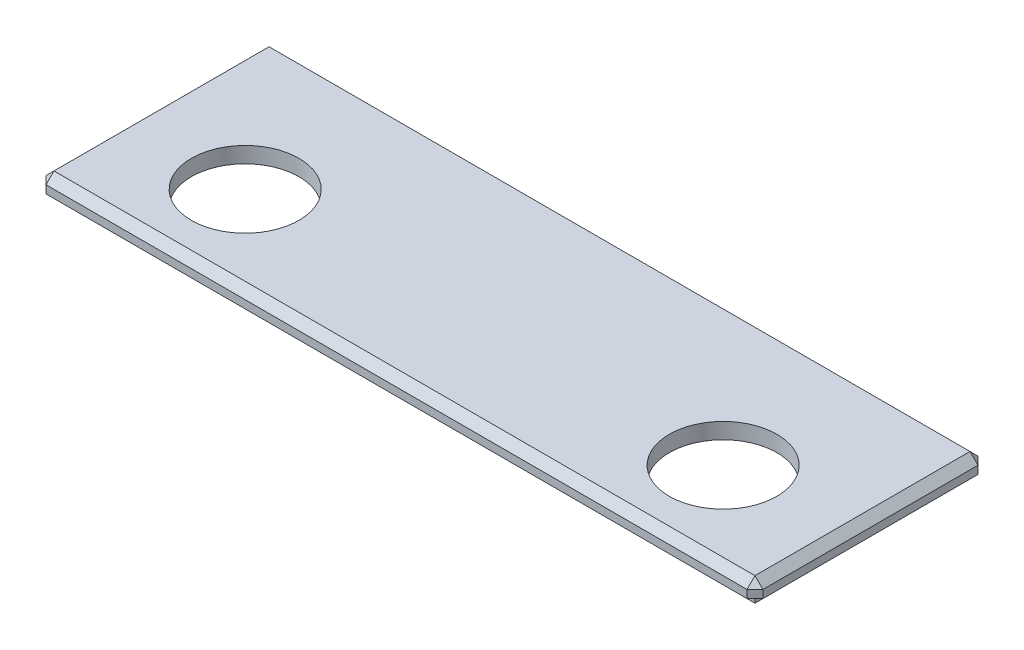
ISO-10303-21;
HEADER;
FILE_DESCRIPTION(('STEP AP214'),'2;1');
FILE_NAME('part.step','',(''),(''),'','','');
FILE_SCHEMA(('AUTOMOTIVE_DESIGN { 1 0 10303 214 1 1 1 1 }'));
ENDSEC;
DATA;
#1=APPLICATION_CONTEXT('core data for automotive mechanical design processes');
#2=APPLICATION_PROTOCOL_DEFINITION('international standard','automotive_design',2000,#1);
#3=PRODUCT_CONTEXT('',#1,'mechanical');
#4=PRODUCT('Part','Part','',(#3));
#5=PRODUCT_RELATED_PRODUCT_CATEGORY('part','',(#4));
#6=PRODUCT_DEFINITION_FORMATION('','',#4);
#7=PRODUCT_DEFINITION_CONTEXT('part definition',#1,'design');
#8=PRODUCT_DEFINITION('design','',#6,#7);
#9=PRODUCT_DEFINITION_SHAPE('','',#8);
#10=(LENGTH_UNIT() NAMED_UNIT(*) SI_UNIT(.MILLI.,.METRE.));
#11=(NAMED_UNIT(*) PLANE_ANGLE_UNIT() SI_UNIT($,.RADIAN.));
#12=(NAMED_UNIT(*) SI_UNIT($,.STERADIAN.) SOLID_ANGLE_UNIT());
#13=UNCERTAINTY_MEASURE_WITH_UNIT(LENGTH_MEASURE(1.E-05),#10,'distance_accuracy_value','');
#14=(GEOMETRIC_REPRESENTATION_CONTEXT(3) GLOBAL_UNCERTAINTY_ASSIGNED_CONTEXT((#13)) GLOBAL_UNIT_ASSIGNED_CONTEXT((#10,
#11,#12)) REPRESENTATION_CONTEXT('',''));
#15=CARTESIAN_POINT('',(0.,0.,0.));
#16=DIRECTION('',(0.,0.,1.));
#17=DIRECTION('',(1.,0.,0.));
#18=AXIS2_PLACEMENT_3D('',#15,#16,#17);
#19=CARTESIAN_POINT('',(0.,0.,0.));
#20=DIRECTION('',(0.,-1.,0.));
#21=DIRECTION('',(0.,0.,-1.));
#22=AXIS2_PLACEMENT_3D('',#19,#20,#21);
#23=PLANE('',#22);
#24=DIRECTION('',(0.,0.,1.));
#25=VECTOR('',#24,1.);
#26=CARTESIAN_POINT('',(-45.,0.,14.5));
#27=LINE('',#26,#25);
#28=CARTESIAN_POINT('',(-45.,0.,-13.5));
#29=VERTEX_POINT('',#28);
#30=CARTESIAN_POINT('',(-45.,0.,13.5));
#31=VERTEX_POINT('',#30);
#32=EDGE_CURVE('E245',#29,#31,#27,.T.);
#33=ORIENTED_EDGE('',*,*,#32,.F.);
#34=DIRECTION('',(-0.707106781186552,0.,0.707106781186543));
#35=VECTOR('',#34,1.);
#36=CARTESIAN_POINT('',(-29.2499999999997,0.,-29.2500000000001));
#37=LINE('',#36,#35);
#38=CARTESIAN_POINT('',(-44.,0.,-14.5));
#39=VERTEX_POINT('',#38);
#40=EDGE_CURVE('E264',#29,#39,#37,.F.);
#41=ORIENTED_EDGE('',*,*,#40,.T.);
#42=DIRECTION('',(-1.,0.,0.));
#43=VECTOR('',#42,1.);
#44=CARTESIAN_POINT('',(-45.,0.,-14.5));
#45=LINE('',#44,#43);
#46=CARTESIAN_POINT('',(44.,0.,-14.5));
#47=VERTEX_POINT('',#46);
#48=EDGE_CURVE('E242',#47,#39,#45,.T.);
#49=ORIENTED_EDGE('',*,*,#48,.F.);
#50=DIRECTION('',(-0.707106781186543,0.,-0.707106781186552));
#51=VECTOR('',#50,1.);
#52=CARTESIAN_POINT('',(29.2500000000003,0.,-29.2499999999999));
#53=LINE('',#52,#51);
#54=CARTESIAN_POINT('',(45.,0.,-13.5));
#55=VERTEX_POINT('',#54);
#56=EDGE_CURVE('E260',#47,#55,#53,.F.);
#57=ORIENTED_EDGE('',*,*,#56,.T.);
#58=DIRECTION('',(0.,0.,-1.));
#59=VECTOR('',#58,1.);
#60=CARTESIAN_POINT('',(45.,0.,14.5));
#61=LINE('',#60,#59);
#62=CARTESIAN_POINT('',(45.,0.,13.5));
#63=VERTEX_POINT('',#62);
#64=EDGE_CURVE('E239',#63,#55,#61,.T.);
#65=ORIENTED_EDGE('',*,*,#64,.F.);
#66=DIRECTION('',(0.707106781186552,0.,-0.707106781186543));
#67=VECTOR('',#66,1.);
#68=CARTESIAN_POINT('',(29.2499999999997,0.,29.2500000000001));
#69=LINE('',#68,#67);
#70=CARTESIAN_POINT('',(44.,0.,14.5));
#71=VERTEX_POINT('',#70);
#72=EDGE_CURVE('E258',#63,#71,#69,.F.);
#73=ORIENTED_EDGE('',*,*,#72,.T.);
#74=DIRECTION('',(1.,0.,0.));
#75=VECTOR('',#74,1.);
#76=CARTESIAN_POINT('',(-45.,0.,14.5));
#77=LINE('',#76,#75);
#78=CARTESIAN_POINT('',(-44.,0.,14.5));
#79=VERTEX_POINT('',#78);
#80=EDGE_CURVE('E248',#79,#71,#77,.T.);
#81=ORIENTED_EDGE('',*,*,#80,.F.);
#82=DIRECTION('',(0.707106781186552,0.,0.707106781186543));
#83=VECTOR('',#82,1.);
#84=CARTESIAN_POINT('',(-29.2499999999997,0.,29.2500000000001));
#85=LINE('',#84,#83);
#86=EDGE_CURVE('E262',#79,#31,#85,.F.);
#87=ORIENTED_EDGE('',*,*,#86,.T.);
#88=EDGE_LOOP('',(#33,#41,#49,#57,#65,#73,#81,#87));
#89=FACE_BOUND('',#88,.T.);
#90=DIRECTION('',(-1.,0.,0.));
#91=VECTOR('',#90,1.);
#92=CARTESIAN_POINT('',(-43.,0.,12.5));
#93=LINE('',#92,#91);
#94=CARTESIAN_POINT('',(43.,0.,12.5));
#95=VERTEX_POINT('',#94);
#96=CARTESIAN_POINT('',(-43.,0.,12.5));
#97=VERTEX_POINT('',#96);
#98=EDGE_CURVE('E213',#95,#97,#93,.T.);
#99=ORIENTED_EDGE('',*,*,#98,.F.);
#100=DIRECTION('',(0.,0.,1.));
#101=VECTOR('',#100,1.);
#102=CARTESIAN_POINT('',(43.,0.,-12.5));
#103=LINE('',#102,#101);
#104=CARTESIAN_POINT('',(43.,0.,-12.5));
#105=VERTEX_POINT('',#104);
#106=EDGE_CURVE('E178',#105,#95,#103,.T.);
#107=ORIENTED_EDGE('',*,*,#106,.F.);
#108=DIRECTION('',(1.,0.,0.));
#109=VECTOR('',#108,1.);
#110=CARTESIAN_POINT('',(-43.,0.,-12.5));
#111=LINE('',#110,#109);
#112=CARTESIAN_POINT('',(-43.,0.,-12.5));
#113=VERTEX_POINT('',#112);
#114=EDGE_CURVE('E204',#113,#105,#111,.T.);
#115=ORIENTED_EDGE('',*,*,#114,.F.);
#116=DIRECTION('',(0.,0.,-1.));
#117=VECTOR('',#116,1.);
#118=CARTESIAN_POINT('',(-43.,0.,-12.5));
#119=LINE('',#118,#117);
#120=EDGE_CURVE('E215',#97,#113,#119,.T.);
#121=ORIENTED_EDGE('',*,*,#120,.F.);
#122=EDGE_LOOP('',(#99,#107,#115,#121));
#123=FACE_BOUND('',#122,.T.);
#124=ADVANCED_FACE('F33',(#89,#123),#23,.T.);
#125=CARTESIAN_POINT('',(45.,2.,14.5));
#126=DIRECTION('',(-1.,0.,0.));
#127=DIRECTION('',(0.,0.,1.));
#128=AXIS2_PLACEMENT_3D('',#125,#126,#127);
#129=PLANE('',#128);
#130=ORIENTED_EDGE('',*,*,#64,.T.);
#131=DIRECTION('',(0.,1.,0.));
#132=VECTOR('',#131,1.);
#133=CARTESIAN_POINT('',(45.,2.,-13.5));
#134=LINE('',#133,#132);
#135=CARTESIAN_POINT('',(45.,0.999999999999999,-13.5));
#136=VERTEX_POINT('',#135);
#137=EDGE_CURVE('E11',#55,#136,#134,.T.);
#138=ORIENTED_EDGE('',*,*,#137,.T.);
#139=DIRECTION('',(0.,0.,1.));
#140=VECTOR('',#139,1.);
#141=CARTESIAN_POINT('',(45.,0.999999999999999,14.5));
#142=LINE('',#141,#140);
#143=CARTESIAN_POINT('',(45.,0.999999999999999,13.5));
#144=VERTEX_POINT('',#143);
#145=EDGE_CURVE('E42',#136,#144,#142,.T.);
#146=ORIENTED_EDGE('',*,*,#145,.T.);
#147=DIRECTION('',(0.,-1.,0.));
#148=VECTOR('',#147,1.);
#149=CARTESIAN_POINT('',(45.,2.,13.5));
#150=LINE('',#149,#148);
#151=EDGE_CURVE('E287',#144,#63,#150,.T.);
#152=ORIENTED_EDGE('',*,*,#151,.T.);
#153=EDGE_LOOP('',(#130,#138,#146,#152));
#154=FACE_BOUND('',#153,.T.);
#155=ADVANCED_FACE('F335',(#154),#129,.F.);
#156=CARTESIAN_POINT('',(-45.,2.,-14.5));
#157=DIRECTION('',(0.,0.,1.));
#158=DIRECTION('',(1.,0.,0.));
#159=AXIS2_PLACEMENT_3D('',#156,#157,#158);
#160=PLANE('',#159);
#161=ORIENTED_EDGE('',*,*,#48,.T.);
#162=DIRECTION('',(0.,1.,0.));
#163=VECTOR('',#162,1.);
#164=CARTESIAN_POINT('',(-44.,2.,-14.5));
#165=LINE('',#164,#163);
#166=CARTESIAN_POINT('',(-44.,0.999999999999999,-14.5));
#167=VERTEX_POINT('',#166);
#168=EDGE_CURVE('E270',#39,#167,#165,.T.);
#169=ORIENTED_EDGE('',*,*,#168,.T.);
#170=DIRECTION('',(1.,0.,0.));
#171=VECTOR('',#170,1.);
#172=CARTESIAN_POINT('',(-45.,0.999999999999999,-14.5));
#173=LINE('',#172,#171);
#174=CARTESIAN_POINT('',(44.,0.999999999999999,-14.5));
#175=VERTEX_POINT('',#174);
#176=EDGE_CURVE('E266',#167,#175,#173,.T.);
#177=ORIENTED_EDGE('',*,*,#176,.T.);
#178=DIRECTION('',(0.,-1.,0.));
#179=VECTOR('',#178,1.);
#180=CARTESIAN_POINT('',(44.,2.,-14.5));
#181=LINE('',#180,#179);
#182=EDGE_CURVE('E268',#175,#47,#181,.T.);
#183=ORIENTED_EDGE('',*,*,#182,.T.);
#184=EDGE_LOOP('',(#161,#169,#177,#183));
#185=FACE_BOUND('',#184,.T.);
#186=ADVANCED_FACE('F387',(#185),#160,.F.);
#187=CARTESIAN_POINT('',(-45.,2.,14.5));
#188=DIRECTION('',(1.,0.,0.));
#189=DIRECTION('',(0.,0.,-1.));
#190=AXIS2_PLACEMENT_3D('',#187,#188,#189);
#191=PLANE('',#190);
#192=DIRECTION('',(0.,0.,-1.));
#193=VECTOR('',#192,1.);
#194=CARTESIAN_POINT('',(-45.,0.999999999999999,14.5));
#195=LINE('',#194,#193);
#196=CARTESIAN_POINT('',(-45.,0.999999999999999,13.5));
#197=VERTEX_POINT('',#196);
#198=CARTESIAN_POINT('',(-45.,0.999999999999999,-13.5));
#199=VERTEX_POINT('',#198);
#200=EDGE_CURVE('E253',#197,#199,#195,.T.);
#201=ORIENTED_EDGE('',*,*,#200,.T.);
#202=DIRECTION('',(0.,-1.,0.));
#203=VECTOR('',#202,1.);
#204=CARTESIAN_POINT('',(-45.,2.,-13.5));
#205=LINE('',#204,#203);
#206=EDGE_CURVE('E255',#199,#29,#205,.T.);
#207=ORIENTED_EDGE('',*,*,#206,.T.);
#208=ORIENTED_EDGE('',*,*,#32,.T.);
#209=DIRECTION('',(0.,1.,0.));
#210=VECTOR('',#209,1.);
#211=CARTESIAN_POINT('',(-45.,2.,13.5));
#212=LINE('',#211,#210);
#213=EDGE_CURVE('E251',#31,#197,#212,.T.);
#214=ORIENTED_EDGE('',*,*,#213,.T.);
#215=EDGE_LOOP('',(#201,#207,#208,#214));
#216=FACE_BOUND('',#215,.T.);
#217=ADVANCED_FACE('F381',(#216),#191,.F.);
#218=CARTESIAN_POINT('',(-45.,2.,14.5));
#219=DIRECTION('',(0.,0.,-1.));
#220=DIRECTION('',(-1.,0.,0.));
#221=AXIS2_PLACEMENT_3D('',#218,#219,#220);
#222=PLANE('',#221);
#223=DIRECTION('',(-1.,0.,0.));
#224=VECTOR('',#223,1.);
#225=CARTESIAN_POINT('',(-45.,0.999999999999999,14.5));
#226=LINE('',#225,#224);
#227=CARTESIAN_POINT('',(44.,0.999999999999999,14.5));
#228=VERTEX_POINT('',#227);
#229=CARTESIAN_POINT('',(-44.,0.999999999999999,14.5));
#230=VERTEX_POINT('',#229);
#231=EDGE_CURVE('E281',#228,#230,#226,.T.);
#232=ORIENTED_EDGE('',*,*,#231,.T.);
#233=DIRECTION('',(0.,-1.,0.));
#234=VECTOR('',#233,1.);
#235=CARTESIAN_POINT('',(-44.,2.,14.5));
#236=LINE('',#235,#234);
#237=EDGE_CURVE('E285',#230,#79,#236,.T.);
#238=ORIENTED_EDGE('',*,*,#237,.T.);
#239=ORIENTED_EDGE('',*,*,#80,.T.);
#240=DIRECTION('',(0.,1.,0.));
#241=VECTOR('',#240,1.);
#242=CARTESIAN_POINT('',(44.,2.,14.5));
#243=LINE('',#242,#241);
#244=EDGE_CURVE('E283',#71,#228,#243,.T.);
#245=ORIENTED_EDGE('',*,*,#244,.T.);
#246=EDGE_LOOP('',(#232,#238,#239,#245));
#247=FACE_BOUND('',#246,.T.);
#248=ADVANCED_FACE('F375',(#247),#222,.F.);
#249=CARTESIAN_POINT('',(0.,2.,0.));
#250=DIRECTION('',(0.,-1.,0.));
#251=DIRECTION('',(0.,0.,-1.));
#252=AXIS2_PLACEMENT_3D('',#249,#250,#251);
#253=PLANE('',#252);
#254=CARTESIAN_POINT('',(-30.,2.,3.5));
#255=DIRECTION('',(0.,1.,0.));
#256=DIRECTION('',(0.,0.,1.));
#257=AXIS2_PLACEMENT_3D('',#254,#255,#256);
#258=CIRCLE('',#257,6.75);
#259=CARTESIAN_POINT('',(-30.,2.,10.25));
#260=VERTEX_POINT('',#259);
#261=EDGE_CURVE('E231',#260,#260,#258,.T.);
#262=ORIENTED_EDGE('',*,*,#261,.F.);
#263=EDGE_LOOP('',(#262));
#264=FACE_BOUND('',#263,.T.);
#265=CARTESIAN_POINT('',(30.,2.,3.5));
#266=DIRECTION('',(0.,1.,0.));
#267=DIRECTION('',(0.,0.,1.));
#268=AXIS2_PLACEMENT_3D('',#265,#266,#267);
#269=CIRCLE('',#268,6.75);
#270=CARTESIAN_POINT('',(30.,2.,10.25));
#271=VERTEX_POINT('',#270);
#272=EDGE_CURVE('E226',#271,#271,#269,.T.);
#273=ORIENTED_EDGE('',*,*,#272,.F.);
#274=EDGE_LOOP('',(#273));
#275=FACE_BOUND('',#274,.T.);
#276=DIRECTION('',(-1.,0.,0.));
#277=VECTOR('',#276,1.);
#278=CARTESIAN_POINT('',(0.,2.,-13.5));
#279=LINE('',#278,#277);
#280=CARTESIAN_POINT('',(44.,2.,-13.5));
#281=VERTEX_POINT('',#280);
#282=CARTESIAN_POINT('',(-44.,2.,-13.5));
#283=VERTEX_POINT('',#282);
#284=EDGE_CURVE('E276',#281,#283,#279,.T.);
#285=ORIENTED_EDGE('',*,*,#284,.T.);
#286=DIRECTION('',(0.,0.,1.));
#287=VECTOR('',#286,1.);
#288=CARTESIAN_POINT('',(-44.,2.,0.));
#289=LINE('',#288,#287);
#290=CARTESIAN_POINT('',(-44.,2.,13.5));
#291=VERTEX_POINT('',#290);
#292=EDGE_CURVE('E278',#283,#291,#289,.T.);
#293=ORIENTED_EDGE('',*,*,#292,.T.);
#294=DIRECTION('',(1.,0.,0.));
#295=VECTOR('',#294,1.);
#296=CARTESIAN_POINT('',(0.,2.,13.5));
#297=LINE('',#296,#295);
#298=CARTESIAN_POINT('',(44.,2.,13.5));
#299=VERTEX_POINT('',#298);
#300=EDGE_CURVE('E272',#291,#299,#297,.T.);
#301=ORIENTED_EDGE('',*,*,#300,.T.);
#302=DIRECTION('',(0.,0.,-1.));
#303=VECTOR('',#302,1.);
#304=CARTESIAN_POINT('',(44.,2.,0.));
#305=LINE('',#304,#303);
#306=EDGE_CURVE('E274',#299,#281,#305,.T.);
#307=ORIENTED_EDGE('',*,*,#306,.T.);
#308=EDGE_LOOP('',(#285,#293,#301,#307));
#309=FACE_BOUND('',#308,.T.);
#310=ADVANCED_FACE('F359',(#264,#275,#309),#253,.F.);
#311=DIRECTION('',(0.,0.,1.));
#312=VECTOR('',#311,1.);
#313=CARTESIAN_POINT('',(41.,0.,-10.5));
#314=LINE('',#313,#312);
#315=CARTESIAN_POINT('',(41.,0.,-10.5));
#316=VERTEX_POINT('',#315);
#317=CARTESIAN_POINT('',(41.,0.,10.5));
#318=VERTEX_POINT('',#317);
#319=EDGE_CURVE('E58',#316,#318,#314,.T.);
#320=ORIENTED_EDGE('',*,*,#319,.T.);
#321=DIRECTION('',(-1.,0.,0.));
#322=VECTOR('',#321,1.);
#323=CARTESIAN_POINT('',(-41.,0.,10.5));
#324=LINE('',#323,#322);
#325=CARTESIAN_POINT('',(-41.,0.,10.5));
#326=VERTEX_POINT('',#325);
#327=EDGE_CURVE('E177',#318,#326,#324,.T.);
#328=ORIENTED_EDGE('',*,*,#327,.T.);
#329=DIRECTION('',(0.,0.,-1.));
#330=VECTOR('',#329,1.);
#331=CARTESIAN_POINT('',(-41.,0.,-10.5));
#332=LINE('',#331,#330);
#333=CARTESIAN_POINT('',(-41.,0.,-10.5));
#334=VERTEX_POINT('',#333);
#335=EDGE_CURVE('E192',#326,#334,#332,.T.);
#336=ORIENTED_EDGE('',*,*,#335,.T.);
#337=DIRECTION('',(1.,0.,0.));
#338=VECTOR('',#337,1.);
#339=CARTESIAN_POINT('',(-41.,0.,-10.5));
#340=LINE('',#339,#338);
#341=EDGE_CURVE('E171',#334,#316,#340,.T.);
#342=ORIENTED_EDGE('',*,*,#341,.T.);
#343=EDGE_LOOP('',(#320,#328,#336,#342));
#344=FACE_BOUND('',#343,.T.);
#345=CARTESIAN_POINT('',(-30.,0.,3.5));
#346=DIRECTION('',(0.,1.,0.));
#347=DIRECTION('',(0.,0.,1.));
#348=AXIS2_PLACEMENT_3D('',#345,#346,#347);
#349=CIRCLE('',#348,6.75);
#350=CARTESIAN_POINT('',(-30.,0.,10.25));
#351=VERTEX_POINT('',#350);
#352=EDGE_CURVE('E227',#351,#351,#349,.T.);
#353=ORIENTED_EDGE('',*,*,#352,.T.);
#354=EDGE_LOOP('',(#353));
#355=FACE_BOUND('',#354,.T.);
#356=CARTESIAN_POINT('',(30.,0.,3.5));
#357=DIRECTION('',(0.,1.,0.));
#358=DIRECTION('',(0.,0.,1.));
#359=AXIS2_PLACEMENT_3D('',#356,#357,#358);
#360=CIRCLE('',#359,6.75);
#361=CARTESIAN_POINT('',(30.,0.,10.25));
#362=VERTEX_POINT('',#361);
#363=EDGE_CURVE('E234',#362,#362,#360,.T.);
#364=ORIENTED_EDGE('',*,*,#363,.T.);
#365=EDGE_LOOP('',(#364));
#366=FACE_BOUND('',#365,.T.);
#367=ADVANCED_FACE('F401',(#344,#355,#366),#23,.T.);
#368=CARTESIAN_POINT('',(45.,2.,13.5));
#369=DIRECTION('',(-0.707106781186543,0.,-0.707106781186552));
#370=DIRECTION('',(0.,-1.,0.));
#371=AXIS2_PLACEMENT_3D('',#368,#369,#370);
#372=PLANE('',#371);
#373=DIRECTION('',(-0.707106781186552,0.,0.707106781186543));
#374=VECTOR('',#373,1.);
#375=CARTESIAN_POINT('',(45.,0.999999999999999,13.5));
#376=LINE('',#375,#374);
#377=EDGE_CURVE('E37',#228,#144,#376,.F.);
#378=ORIENTED_EDGE('',*,*,#377,.F.);
#379=ORIENTED_EDGE('',*,*,#244,.F.);
#380=ORIENTED_EDGE('',*,*,#72,.F.);
#381=ORIENTED_EDGE('',*,*,#151,.F.);
#382=EDGE_LOOP('',(#378,#379,#380,#381));
#383=FACE_BOUND('',#382,.T.);
#384=ADVANCED_FACE('F35',(#383),#372,.F.);
#385=CARTESIAN_POINT('',(45.,0.999999999999999,13.5));
#386=DIRECTION('',(0.577350269189626,0.577350269189618,0.577350269189634));
#387=DIRECTION('',(0.707106781186552,0.,-0.707106781186543));
#388=AXIS2_PLACEMENT_3D('',#385,#386,#387);
#389=PLANE('',#388);
#390=DIRECTION('',(0.,0.707106781186552,-0.707106781186543));
#391=VECTOR('',#390,1.);
#392=CARTESIAN_POINT('',(44.,1.5,14.));
#393=LINE('',#392,#391);
#394=EDGE_CURVE('E315',#228,#299,#393,.T.);
#395=ORIENTED_EDGE('',*,*,#394,.F.);
#396=ORIENTED_EDGE('',*,*,#377,.T.);
#397=DIRECTION('',(0.707106781186543,-0.707106781186552,0.));
#398=VECTOR('',#397,1.);
#399=CARTESIAN_POINT('',(45.,0.999999999999999,13.5));
#400=LINE('',#399,#398);
#401=EDGE_CURVE('E317',#299,#144,#400,.T.);
#402=ORIENTED_EDGE('',*,*,#401,.F.);
#403=EDGE_LOOP('',(#395,#396,#402));
#404=FACE_BOUND('',#403,.T.);
#405=ADVANCED_FACE('F327',(#404),#389,.T.);
#406=CARTESIAN_POINT('',(44.,2.,-14.5));
#407=DIRECTION('',(-0.707106781186552,0.,0.707106781186543));
#408=DIRECTION('',(0.,-1.,0.));
#409=AXIS2_PLACEMENT_3D('',#406,#407,#408);
#410=PLANE('',#409);
#411=ORIENTED_EDGE('',*,*,#56,.F.);
#412=ORIENTED_EDGE('',*,*,#182,.F.);
#413=DIRECTION('',(0.707106781186543,0.,0.707106781186552));
#414=VECTOR('',#413,1.);
#415=CARTESIAN_POINT('',(45.,0.999999999999999,-13.5));
#416=LINE('',#415,#414);
#417=EDGE_CURVE('E312',#136,#175,#416,.F.);
#418=ORIENTED_EDGE('',*,*,#417,.F.);
#419=ORIENTED_EDGE('',*,*,#137,.F.);
#420=EDGE_LOOP('',(#411,#412,#418,#419));
#421=FACE_BOUND('',#420,.T.);
#422=ADVANCED_FACE('F345',(#421),#410,.F.);
#423=CARTESIAN_POINT('',(44.,2.,0.));
#424=DIRECTION('',(-0.707106781186552,-0.707106781186543,0.));
#425=DIRECTION('',(0.,0.,-1.));
#426=AXIS2_PLACEMENT_3D('',#423,#424,#425);
#427=PLANE('',#426);
#428=ORIENTED_EDGE('',*,*,#401,.T.);
#429=ORIENTED_EDGE('',*,*,#145,.F.);
#430=DIRECTION('',(-0.707106781186543,0.707106781186552,0.));
#431=VECTOR('',#430,1.);
#432=CARTESIAN_POINT('',(45.,0.999999999999999,-13.5));
#433=LINE('',#432,#431);
#434=EDGE_CURVE('E309',#281,#136,#433,.F.);
#435=ORIENTED_EDGE('',*,*,#434,.F.);
#436=ORIENTED_EDGE('',*,*,#306,.F.);
#437=EDGE_LOOP('',(#428,#429,#435,#436));
#438=FACE_BOUND('',#437,.T.);
#439=ADVANCED_FACE('F348',(#438),#427,.F.);
#440=CARTESIAN_POINT('',(0.,2.,13.5));
#441=DIRECTION('',(0.,-0.707106781186543,-0.707106781186552));
#442=DIRECTION('',(1.,0.,0.));
#443=AXIS2_PLACEMENT_3D('',#440,#441,#442);
#444=PLANE('',#443);
#445=ORIENTED_EDGE('',*,*,#394,.T.);
#446=ORIENTED_EDGE('',*,*,#300,.F.);
#447=DIRECTION('',(0.,-0.707106781186552,0.707106781186543));
#448=VECTOR('',#447,1.);
#449=CARTESIAN_POINT('',(-44.,2.,13.5));
#450=LINE('',#449,#448);
#451=EDGE_CURVE('E306',#230,#291,#450,.F.);
#452=ORIENTED_EDGE('',*,*,#451,.F.);
#453=ORIENTED_EDGE('',*,*,#231,.F.);
#454=EDGE_LOOP('',(#445,#446,#452,#453));
#455=FACE_BOUND('',#454,.T.);
#456=ADVANCED_FACE('F372',(#455),#444,.F.);
#457=CARTESIAN_POINT('',(-44.,2.,14.5));
#458=DIRECTION('',(0.707106781186543,0.,-0.707106781186552));
#459=DIRECTION('',(0.,-1.,0.));
#460=AXIS2_PLACEMENT_3D('',#457,#458,#459);
#461=PLANE('',#460);
#462=ORIENTED_EDGE('',*,*,#86,.F.);
#463=ORIENTED_EDGE('',*,*,#237,.F.);
#464=DIRECTION('',(-0.707106781186552,0.,-0.707106781186543));
#465=VECTOR('',#464,1.);
#466=CARTESIAN_POINT('',(-44.5,0.999999999999999,14.));
#467=LINE('',#466,#465);
#468=EDGE_CURVE('E303',#197,#230,#467,.F.);
#469=ORIENTED_EDGE('',*,*,#468,.F.);
#470=ORIENTED_EDGE('',*,*,#213,.F.);
#471=EDGE_LOOP('',(#462,#463,#469,#470));
#472=FACE_BOUND('',#471,.T.);
#473=ADVANCED_FACE('F378',(#472),#461,.F.);
#474=CARTESIAN_POINT('',(45.,0.999999999999999,-13.5));
#475=DIRECTION('',(0.577350269189634,0.577350269189618,-0.577350269189626));
#476=DIRECTION('',(-0.707106781186543,0.,-0.707106781186552));
#477=AXIS2_PLACEMENT_3D('',#474,#475,#476);
#478=PLANE('',#477);
#479=ORIENTED_EDGE('',*,*,#434,.T.);
#480=ORIENTED_EDGE('',*,*,#417,.T.);
#481=DIRECTION('',(0.,-0.707106781186552,-0.707106781186543));
#482=VECTOR('',#481,1.);
#483=CARTESIAN_POINT('',(44.,1.5,-14.));
#484=LINE('',#483,#482);
#485=EDGE_CURVE('E300',#281,#175,#484,.T.);
#486=ORIENTED_EDGE('',*,*,#485,.F.);
#487=EDGE_LOOP('',(#479,#480,#486));
#488=FACE_BOUND('',#487,.T.);
#489=ADVANCED_FACE('F352',(#488),#478,.T.);
#490=CARTESIAN_POINT('',(-44.,2.,13.5));
#491=DIRECTION('',(-0.577350269189626,0.577350269189618,0.577350269189634));
#492=DIRECTION('',(0.707106781186552,0.,0.707106781186543));
#493=AXIS2_PLACEMENT_3D('',#490,#491,#492);
#494=PLANE('',#493);
#495=ORIENTED_EDGE('',*,*,#468,.T.);
#496=ORIENTED_EDGE('',*,*,#451,.T.);
#497=DIRECTION('',(0.707106781186543,0.707106781186552,0.));
#498=VECTOR('',#497,1.);
#499=CARTESIAN_POINT('',(-44.,2.,13.5));
#500=LINE('',#499,#498);
#501=EDGE_CURVE('E298',#197,#291,#500,.T.);
#502=ORIENTED_EDGE('',*,*,#501,.F.);
#503=EDGE_LOOP('',(#495,#496,#502));
#504=FACE_BOUND('',#503,.T.);
#505=ADVANCED_FACE('F369',(#504),#494,.T.);
#506=CARTESIAN_POINT('',(0.,2.,-13.5));
#507=DIRECTION('',(0.,-0.707106781186543,0.707106781186552));
#508=DIRECTION('',(-1.,0.,0.));
#509=AXIS2_PLACEMENT_3D('',#506,#507,#508);
#510=PLANE('',#509);
#511=ORIENTED_EDGE('',*,*,#485,.T.);
#512=ORIENTED_EDGE('',*,*,#176,.F.);
#513=DIRECTION('',(0.,0.707106781186552,0.707106781186543));
#514=VECTOR('',#513,1.);
#515=CARTESIAN_POINT('',(-44.,0.999999999999999,-14.5));
#516=LINE('',#515,#514);
#517=EDGE_CURVE('E295',#283,#167,#516,.F.);
#518=ORIENTED_EDGE('',*,*,#517,.F.);
#519=ORIENTED_EDGE('',*,*,#284,.F.);
#520=EDGE_LOOP('',(#511,#512,#518,#519));
#521=FACE_BOUND('',#520,.T.);
#522=ADVANCED_FACE('F356',(#521),#510,.F.);
#523=CARTESIAN_POINT('',(-44.,2.,0.));
#524=DIRECTION('',(0.707106781186552,-0.707106781186543,0.));
#525=DIRECTION('',(0.,0.,1.));
#526=AXIS2_PLACEMENT_3D('',#523,#524,#525);
#527=PLANE('',#526);
#528=ORIENTED_EDGE('',*,*,#501,.T.);
#529=ORIENTED_EDGE('',*,*,#292,.F.);
#530=DIRECTION('',(-0.707106781186543,-0.707106781186552,0.));
#531=VECTOR('',#530,1.);
#532=CARTESIAN_POINT('',(-44.5,1.5,-13.5));
#533=LINE('',#532,#531);
#534=EDGE_CURVE('E292',#199,#283,#533,.F.);
#535=ORIENTED_EDGE('',*,*,#534,.F.);
#536=ORIENTED_EDGE('',*,*,#200,.F.);
#537=EDGE_LOOP('',(#528,#529,#535,#536));
#538=FACE_BOUND('',#537,.T.);
#539=ADVANCED_FACE('F362',(#538),#527,.F.);
#540=CARTESIAN_POINT('',(-44.,0.999999999999999,-14.5));
#541=DIRECTION('',(-0.577350269189626,0.577350269189618,-0.577350269189634));
#542=DIRECTION('',(-0.707106781186552,0.,0.707106781186543));
#543=AXIS2_PLACEMENT_3D('',#540,#541,#542);
#544=PLANE('',#543);
#545=ORIENTED_EDGE('',*,*,#534,.T.);
#546=ORIENTED_EDGE('',*,*,#517,.T.);
#547=DIRECTION('',(0.707106781186552,0.,-0.707106781186543));
#548=VECTOR('',#547,1.);
#549=CARTESIAN_POINT('',(-44.,0.999999999999999,-14.5));
#550=LINE('',#549,#548);
#551=EDGE_CURVE('E230',#199,#167,#550,.T.);
#552=ORIENTED_EDGE('',*,*,#551,.F.);
#553=EDGE_LOOP('',(#545,#546,#552));
#554=FACE_BOUND('',#553,.T.);
#555=ADVANCED_FACE('F389',(#554),#544,.T.);
#556=CARTESIAN_POINT('',(-45.,2.,-13.5));
#557=DIRECTION('',(0.707106781186543,0.,0.707106781186552));
#558=DIRECTION('',(0.,-1.,0.));
#559=AXIS2_PLACEMENT_3D('',#556,#557,#558);
#560=PLANE('',#559);
#561=ORIENTED_EDGE('',*,*,#551,.T.);
#562=ORIENTED_EDGE('',*,*,#168,.F.);
#563=ORIENTED_EDGE('',*,*,#40,.F.);
#564=ORIENTED_EDGE('',*,*,#206,.F.);
#565=EDGE_LOOP('',(#561,#562,#563,#564));
#566=FACE_BOUND('',#565,.T.);
#567=ADVANCED_FACE('F384',(#566),#560,.F.);
#568=CARTESIAN_POINT('',(30.,0.,3.5));
#569=DIRECTION('',(0.,1.,0.));
#570=DIRECTION('',(0.,0.,1.));
#571=AXIS2_PLACEMENT_3D('',#568,#569,#570);
#572=CYLINDRICAL_SURFACE('',#571,6.75);
#573=ORIENTED_EDGE('',*,*,#363,.F.);
#574=EDGE_LOOP('',(#573));
#575=FACE_BOUND('',#574,.T.);
#576=ORIENTED_EDGE('',*,*,#272,.T.);
#577=EDGE_LOOP('',(#576));
#578=FACE_BOUND('',#577,.T.);
#579=ADVANCED_FACE('F396',(#575,#578),#572,.F.);
#580=CARTESIAN_POINT('',(-30.,0.,3.5));
#581=DIRECTION('',(0.,1.,0.));
#582=DIRECTION('',(0.,0.,1.));
#583=AXIS2_PLACEMENT_3D('',#580,#581,#582);
#584=CYLINDRICAL_SURFACE('',#583,6.75);
#585=ORIENTED_EDGE('',*,*,#352,.F.);
#586=EDGE_LOOP('',(#585));
#587=FACE_BOUND('',#586,.T.);
#588=ORIENTED_EDGE('',*,*,#261,.T.);
#589=EDGE_LOOP('',(#588));
#590=FACE_BOUND('',#589,.T.);
#591=ADVANCED_FACE('F421',(#587,#590),#584,.F.);
#592=CARTESIAN_POINT('',(0.,-2.,0.));
#593=DIRECTION('',(0.,1.,0.));
#594=DIRECTION('',(0.,0.,1.));
#595=AXIS2_PLACEMENT_3D('',#592,#593,#594);
#596=PLANE('',#595);
#597=DIRECTION('',(0.,0.,1.));
#598=VECTOR('',#597,1.);
#599=CARTESIAN_POINT('',(43.,-2.,-12.5));
#600=LINE('',#599,#598);
#601=CARTESIAN_POINT('',(43.,-2.,-12.5));
#602=VERTEX_POINT('',#601);
#603=CARTESIAN_POINT('',(43.,-2.,12.5));
#604=VERTEX_POINT('',#603);
#605=EDGE_CURVE('E200',#602,#604,#600,.T.);
#606=ORIENTED_EDGE('',*,*,#605,.T.);
#607=DIRECTION('',(-1.,0.,0.));
#608=VECTOR('',#607,1.);
#609=CARTESIAN_POINT('',(-43.,-2.,12.5));
#610=LINE('',#609,#608);
#611=CARTESIAN_POINT('',(-43.,-2.,12.5));
#612=VERTEX_POINT('',#611);
#613=EDGE_CURVE('E203',#604,#612,#610,.T.);
#614=ORIENTED_EDGE('',*,*,#613,.T.);
#615=DIRECTION('',(0.,0.,-1.));
#616=VECTOR('',#615,1.);
#617=CARTESIAN_POINT('',(-43.,-2.,-12.5));
#618=LINE('',#617,#616);
#619=CARTESIAN_POINT('',(-43.,-2.,-12.5));
#620=VERTEX_POINT('',#619);
#621=EDGE_CURVE('E206',#612,#620,#618,.T.);
#622=ORIENTED_EDGE('',*,*,#621,.T.);
#623=DIRECTION('',(1.,0.,0.));
#624=VECTOR('',#623,1.);
#625=CARTESIAN_POINT('',(-43.,-2.,-12.5));
#626=LINE('',#625,#624);
#627=EDGE_CURVE('E208',#620,#602,#626,.T.);
#628=ORIENTED_EDGE('',*,*,#627,.T.);
#629=EDGE_LOOP('',(#606,#614,#622,#628));
#630=FACE_BOUND('',#629,.T.);
#631=DIRECTION('',(0.,0.,1.));
#632=VECTOR('',#631,1.);
#633=CARTESIAN_POINT('',(41.,-2.,-10.5));
#634=LINE('',#633,#632);
#635=CARTESIAN_POINT('',(41.,-2.,-10.5));
#636=VERTEX_POINT('',#635);
#637=CARTESIAN_POINT('',(41.,-2.,10.5));
#638=VERTEX_POINT('',#637);
#639=EDGE_CURVE('E161',#636,#638,#634,.T.);
#640=ORIENTED_EDGE('',*,*,#639,.F.);
#641=DIRECTION('',(1.,0.,0.));
#642=VECTOR('',#641,1.);
#643=CARTESIAN_POINT('',(-41.,-2.,-10.5));
#644=LINE('',#643,#642);
#645=CARTESIAN_POINT('',(-41.,-2.,-10.5));
#646=VERTEX_POINT('',#645);
#647=EDGE_CURVE('E186',#646,#636,#644,.T.);
#648=ORIENTED_EDGE('',*,*,#647,.F.);
#649=DIRECTION('',(0.,0.,-1.));
#650=VECTOR('',#649,1.);
#651=CARTESIAN_POINT('',(-41.,-2.,-10.5));
#652=LINE('',#651,#650);
#653=CARTESIAN_POINT('',(-41.,-2.,10.5));
#654=VERTEX_POINT('',#653);
#655=EDGE_CURVE('E184',#654,#646,#652,.T.);
#656=ORIENTED_EDGE('',*,*,#655,.F.);
#657=DIRECTION('',(-1.,0.,0.));
#658=VECTOR('',#657,1.);
#659=CARTESIAN_POINT('',(-41.,-2.,10.5));
#660=LINE('',#659,#658);
#661=EDGE_CURVE('E170',#638,#654,#660,.T.);
#662=ORIENTED_EDGE('',*,*,#661,.F.);
#663=EDGE_LOOP('',(#640,#648,#656,#662));
#664=FACE_BOUND('',#663,.T.);
#665=ADVANCED_FACE('F182',(#630,#664),#596,.F.);
#666=CARTESIAN_POINT('',(43.,-2.,-12.5));
#667=DIRECTION('',(-1.,0.,0.));
#668=DIRECTION('',(0.,0.,1.));
#669=AXIS2_PLACEMENT_3D('',#666,#667,#668);
#670=PLANE('',#669);
#671=ORIENTED_EDGE('',*,*,#106,.T.);
#672=DIRECTION('',(0.,1.,0.));
#673=VECTOR('',#672,1.);
#674=CARTESIAN_POINT('',(43.,-2.,12.5));
#675=LINE('',#674,#673);
#676=EDGE_CURVE('E224',#604,#95,#675,.T.);
#677=ORIENTED_EDGE('',*,*,#676,.F.);
#678=ORIENTED_EDGE('',*,*,#605,.F.);
#679=DIRECTION('',(0.,1.,0.));
#680=VECTOR('',#679,1.);
#681=CARTESIAN_POINT('',(43.,-2.,-12.5));
#682=LINE('',#681,#680);
#683=EDGE_CURVE('E210',#602,#105,#682,.T.);
#684=ORIENTED_EDGE('',*,*,#683,.T.);
#685=EDGE_LOOP('',(#671,#677,#678,#684));
#686=FACE_BOUND('',#685,.T.);
#687=ADVANCED_FACE('F431',(#686),#670,.F.);
#688=CARTESIAN_POINT('',(-43.,-2.,12.5));
#689=DIRECTION('',(0.,0.,-1.));
#690=DIRECTION('',(-1.,0.,0.));
#691=AXIS2_PLACEMENT_3D('',#688,#689,#690);
#692=PLANE('',#691);
#693=ORIENTED_EDGE('',*,*,#98,.T.);
#694=DIRECTION('',(0.,1.,0.));
#695=VECTOR('',#694,1.);
#696=CARTESIAN_POINT('',(-43.,-2.,12.5));
#697=LINE('',#696,#695);
#698=EDGE_CURVE('E221',#612,#97,#697,.T.);
#699=ORIENTED_EDGE('',*,*,#698,.F.);
#700=ORIENTED_EDGE('',*,*,#613,.F.);
#701=ORIENTED_EDGE('',*,*,#676,.T.);
#702=EDGE_LOOP('',(#693,#699,#700,#701));
#703=FACE_BOUND('',#702,.T.);
#704=ADVANCED_FACE('F434',(#703),#692,.F.);
#705=CARTESIAN_POINT('',(-43.,-2.,-12.5));
#706=DIRECTION('',(1.,0.,0.));
#707=DIRECTION('',(0.,0.,-1.));
#708=AXIS2_PLACEMENT_3D('',#705,#706,#707);
#709=PLANE('',#708);
#710=ORIENTED_EDGE('',*,*,#120,.T.);
#711=DIRECTION('',(0.,1.,0.));
#712=VECTOR('',#711,1.);
#713=CARTESIAN_POINT('',(-43.,-2.,-12.5));
#714=LINE('',#713,#712);
#715=EDGE_CURVE('E50',#620,#113,#714,.T.);
#716=ORIENTED_EDGE('',*,*,#715,.F.);
#717=ORIENTED_EDGE('',*,*,#621,.F.);
#718=ORIENTED_EDGE('',*,*,#698,.T.);
#719=EDGE_LOOP('',(#710,#716,#717,#718));
#720=FACE_BOUND('',#719,.T.);
#721=ADVANCED_FACE('F438',(#720),#709,.F.);
#722=CARTESIAN_POINT('',(-43.,-2.,-12.5));
#723=DIRECTION('',(0.,0.,1.));
#724=DIRECTION('',(1.,0.,0.));
#725=AXIS2_PLACEMENT_3D('',#722,#723,#724);
#726=PLANE('',#725);
#727=ORIENTED_EDGE('',*,*,#114,.T.);
#728=ORIENTED_EDGE('',*,*,#683,.F.);
#729=ORIENTED_EDGE('',*,*,#627,.F.);
#730=ORIENTED_EDGE('',*,*,#715,.T.);
#731=EDGE_LOOP('',(#727,#728,#729,#730));
#732=FACE_BOUND('',#731,.T.);
#733=ADVANCED_FACE('F442',(#732),#726,.F.);
#734=CARTESIAN_POINT('',(41.,-2.,-10.5));
#735=DIRECTION('',(-1.,0.,0.));
#736=DIRECTION('',(0.,0.,1.));
#737=AXIS2_PLACEMENT_3D('',#734,#735,#736);
#738=PLANE('',#737);
#739=ORIENTED_EDGE('',*,*,#319,.F.);
#740=DIRECTION('',(0.,1.,0.));
#741=VECTOR('',#740,1.);
#742=CARTESIAN_POINT('',(41.,-2.,-10.5));
#743=LINE('',#742,#741);
#744=EDGE_CURVE('E166',#636,#316,#743,.T.);
#745=ORIENTED_EDGE('',*,*,#744,.F.);
#746=ORIENTED_EDGE('',*,*,#639,.T.);
#747=DIRECTION('',(0.,1.,0.));
#748=VECTOR('',#747,1.);
#749=CARTESIAN_POINT('',(41.,-2.,10.5));
#750=LINE('',#749,#748);
#751=EDGE_CURVE('E164',#638,#318,#750,.T.);
#752=ORIENTED_EDGE('',*,*,#751,.T.);
#753=EDGE_LOOP('',(#739,#745,#746,#752));
#754=FACE_BOUND('',#753,.T.);
#755=ADVANCED_FACE('F163',(#754),#738,.T.);
#756=CARTESIAN_POINT('',(-41.,-2.,10.5));
#757=DIRECTION('',(0.,0.,-1.));
#758=DIRECTION('',(-1.,0.,0.));
#759=AXIS2_PLACEMENT_3D('',#756,#757,#758);
#760=PLANE('',#759);
#761=ORIENTED_EDGE('',*,*,#327,.F.);
#762=ORIENTED_EDGE('',*,*,#751,.F.);
#763=ORIENTED_EDGE('',*,*,#661,.T.);
#764=DIRECTION('',(0.,1.,0.));
#765=VECTOR('',#764,1.);
#766=CARTESIAN_POINT('',(-41.,-2.,10.5));
#767=LINE('',#766,#765);
#768=EDGE_CURVE('E179',#654,#326,#767,.T.);
#769=ORIENTED_EDGE('',*,*,#768,.T.);
#770=EDGE_LOOP('',(#761,#762,#763,#769));
#771=FACE_BOUND('',#770,.T.);
#772=ADVANCED_FACE('F174',(#771),#760,.T.);
#773=CARTESIAN_POINT('',(-41.,-2.,-10.5));
#774=DIRECTION('',(1.,0.,0.));
#775=DIRECTION('',(0.,0.,-1.));
#776=AXIS2_PLACEMENT_3D('',#773,#774,#775);
#777=PLANE('',#776);
#778=ORIENTED_EDGE('',*,*,#335,.F.);
#779=ORIENTED_EDGE('',*,*,#768,.F.);
#780=ORIENTED_EDGE('',*,*,#655,.T.);
#781=DIRECTION('',(0.,1.,0.));
#782=VECTOR('',#781,1.);
#783=CARTESIAN_POINT('',(-41.,-2.,-10.5));
#784=LINE('',#783,#782);
#785=EDGE_CURVE('E196',#646,#334,#784,.T.);
#786=ORIENTED_EDGE('',*,*,#785,.T.);
#787=EDGE_LOOP('',(#778,#779,#780,#786));
#788=FACE_BOUND('',#787,.T.);
#789=ADVANCED_FACE('F453',(#788),#777,.T.);
#790=CARTESIAN_POINT('',(-41.,-2.,-10.5));
#791=DIRECTION('',(0.,0.,1.));
#792=DIRECTION('',(1.,0.,0.));
#793=AXIS2_PLACEMENT_3D('',#790,#791,#792);
#794=PLANE('',#793);
#795=ORIENTED_EDGE('',*,*,#341,.F.);
#796=ORIENTED_EDGE('',*,*,#785,.F.);
#797=ORIENTED_EDGE('',*,*,#647,.T.);
#798=ORIENTED_EDGE('',*,*,#744,.T.);
#799=EDGE_LOOP('',(#795,#796,#797,#798));
#800=FACE_BOUND('',#799,.T.);
#801=ADVANCED_FACE('F456',(#800),#794,.T.);
#802=CLOSED_SHELL('',(#124,#155,#186,#217,#248,#310,#367,#384,#405,#422,#439,#456,#473,#489,
#505,#522,#539,#555,#567,#579,#591,#665,#687,#704,#721,#733,#755,#772,#789,#801));
#803=MANIFOLD_SOLID_BREP('B2',#802);
#804=ADVANCED_BREP_SHAPE_REPRESENTATION('',(#18,#803),#14);
#805=SHAPE_DEFINITION_REPRESENTATION(#9,#804);
ENDSEC;
END-ISO-10303-21;
